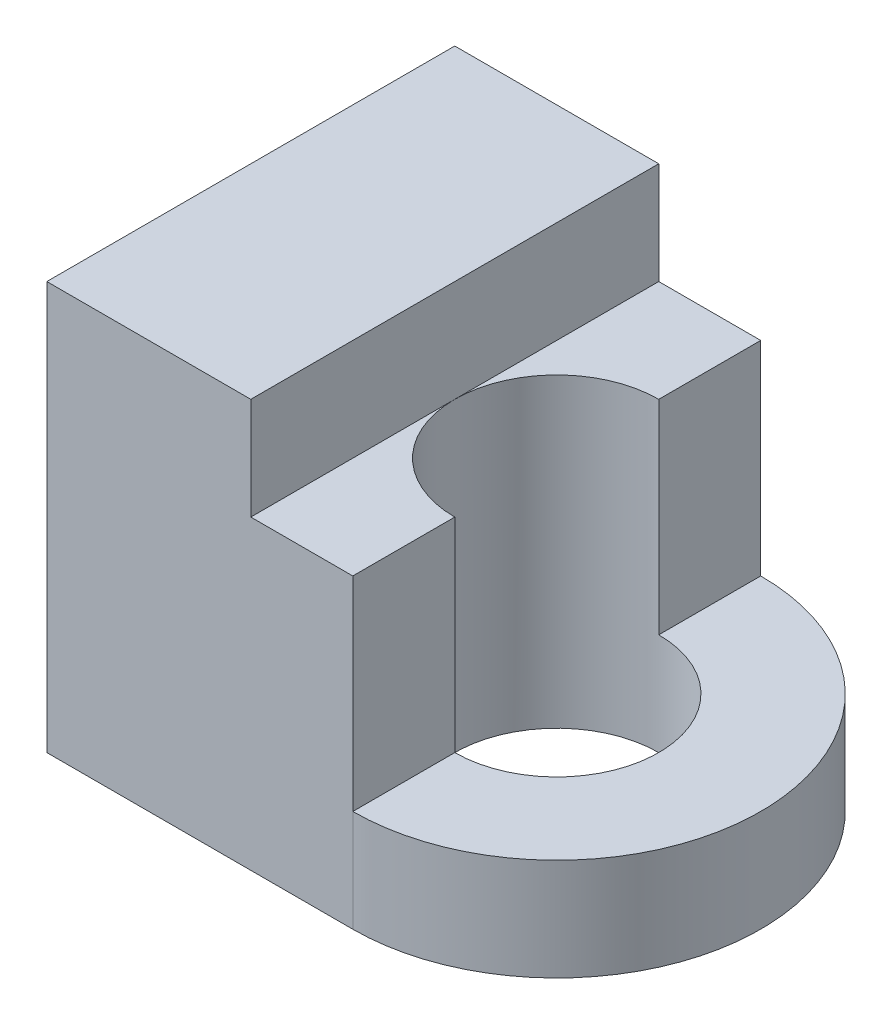
ISO-10303-21;
HEADER;
FILE_DESCRIPTION(('STEP AP214'),'2;1');
FILE_NAME('part.step','',(''),(''),'','','');
FILE_SCHEMA(('AUTOMOTIVE_DESIGN { 1 0 10303 214 1 1 1 1 }'));
ENDSEC;
DATA;
#1=APPLICATION_CONTEXT('core data for automotive mechanical design processes');
#2=APPLICATION_PROTOCOL_DEFINITION('international standard','automotive_design',2000,#1);
#3=PRODUCT_CONTEXT('',#1,'mechanical');
#4=PRODUCT('Part','Part','',(#3));
#5=PRODUCT_RELATED_PRODUCT_CATEGORY('part','',(#4));
#6=PRODUCT_DEFINITION_FORMATION('','',#4);
#7=PRODUCT_DEFINITION_CONTEXT('part definition',#1,'design');
#8=PRODUCT_DEFINITION('design','',#6,#7);
#9=PRODUCT_DEFINITION_SHAPE('','',#8);
#10=(LENGTH_UNIT() NAMED_UNIT(*) SI_UNIT(.MILLI.,.METRE.));
#11=(NAMED_UNIT(*) PLANE_ANGLE_UNIT() SI_UNIT($,.RADIAN.));
#12=(NAMED_UNIT(*) SI_UNIT($,.STERADIAN.) SOLID_ANGLE_UNIT());
#13=UNCERTAINTY_MEASURE_WITH_UNIT(LENGTH_MEASURE(1.E-05),#10,'distance_accuracy_value','');
#14=(GEOMETRIC_REPRESENTATION_CONTEXT(3) GLOBAL_UNCERTAINTY_ASSIGNED_CONTEXT((#13)) GLOBAL_UNIT_ASSIGNED_CONTEXT((#10,
#11,#12)) REPRESENTATION_CONTEXT('',''));
#15=CARTESIAN_POINT('',(0.,0.,0.));
#16=DIRECTION('',(0.,0.,1.));
#17=DIRECTION('',(1.,0.,0.));
#18=AXIS2_PLACEMENT_3D('',#15,#16,#17);
#19=CARTESIAN_POINT('',(0.,40.,0.));
#20=DIRECTION('',(0.,-1.,0.));
#21=DIRECTION('',(0.,0.,-1.));
#22=AXIS2_PLACEMENT_3D('',#19,#20,#21);
#23=CYLINDRICAL_SURFACE('',#22,10.);
#24=CARTESIAN_POINT('',(0.,0.,0.));
#25=DIRECTION('',(0.,1.,0.));
#26=DIRECTION('',(0.,0.,1.));
#27=AXIS2_PLACEMENT_3D('',#24,#25,#26);
#28=CIRCLE('',#27,10.);
#29=CARTESIAN_POINT('',(0.,0.,10.));
#30=VERTEX_POINT('',#29);
#31=EDGE_CURVE('E172',#30,#30,#28,.T.);
#32=ORIENTED_EDGE('',*,*,#31,.F.);
#33=EDGE_LOOP('',(#32));
#34=FACE_BOUND('',#33,.T.);
#35=CARTESIAN_POINT('',(0.,30.,0.));
#36=DIRECTION('',(0.,1.,0.));
#37=DIRECTION('',(0.,0.,1.));
#38=AXIS2_PLACEMENT_3D('',#35,#36,#37);
#39=CIRCLE('',#38,10.);
#40=CARTESIAN_POINT('',(-10.,30.,0.));
#41=VERTEX_POINT('',#40);
#42=CARTESIAN_POINT('',(1.57116660247941E-13,30.,10.));
#43=VERTEX_POINT('',#42);
#44=EDGE_CURVE('E147',#41,#43,#39,.T.);
#45=ORIENTED_EDGE('',*,*,#44,.T.);
#46=DIRECTION('',(0.,-1.,0.));
#47=VECTOR('',#46,1.);
#48=CARTESIAN_POINT('',(1.57116660247941E-13,40.,10.));
#49=LINE('',#48,#47);
#50=CARTESIAN_POINT('',(1.57116660247941E-13,10.,10.));
#51=VERTEX_POINT('',#50);
#52=EDGE_CURVE('E124',#43,#51,#49,.T.);
#53=ORIENTED_EDGE('',*,*,#52,.T.);
#54=CARTESIAN_POINT('',(0.,10.,0.));
#55=DIRECTION('',(0.,-1.,0.));
#56=DIRECTION('',(0.,0.,-1.));
#57=AXIS2_PLACEMENT_3D('',#54,#55,#56);
#58=CIRCLE('',#57,10.);
#59=CARTESIAN_POINT('',(0.,10.,-10.));
#60=VERTEX_POINT('',#59);
#61=EDGE_CURVE('E12',#60,#51,#58,.T.);
#62=ORIENTED_EDGE('',*,*,#61,.F.);
#63=DIRECTION('',(0.,-1.,0.));
#64=VECTOR('',#63,1.);
#65=CARTESIAN_POINT('',(0.,40.,-10.));
#66=LINE('',#65,#64);
#67=CARTESIAN_POINT('',(0.,30.,-10.));
#68=VERTEX_POINT('',#67);
#69=EDGE_CURVE('E131',#60,#68,#66,.F.);
#70=ORIENTED_EDGE('',*,*,#69,.T.);
#71=EDGE_CURVE('E60',#68,#41,#39,.T.);
#72=ORIENTED_EDGE('',*,*,#71,.T.);
#73=EDGE_LOOP('',(#45,#53,#62,#70,#72));
#74=FACE_BOUND('',#73,.T.);
#75=ADVANCED_FACE('F37',(#34,#74),#23,.F.);
#76=CARTESIAN_POINT('',(-5.,30.,0.));
#77=DIRECTION('',(0.,1.,0.));
#78=DIRECTION('',(0.,0.,1.));
#79=AXIS2_PLACEMENT_3D('',#76,#77,#78);
#80=PLANE('',#79);
#81=DIRECTION('',(1.,0.,0.));
#82=VECTOR('',#81,1.);
#83=CARTESIAN_POINT('',(-30.,30.,20.));
#84=LINE('',#83,#82);
#85=CARTESIAN_POINT('',(-10.,30.,20.));
#86=VERTEX_POINT('',#85);
#87=CARTESIAN_POINT('',(2.09488880330588E-13,30.,20.));
#88=VERTEX_POINT('',#87);
#89=EDGE_CURVE('E167',#86,#88,#84,.T.);
#90=ORIENTED_EDGE('',*,*,#89,.T.);
#91=DIRECTION('',(0.,0.,-1.));
#92=VECTOR('',#91,1.);
#93=CARTESIAN_POINT('',(2.09488880330588E-13,30.,20.));
#94=LINE('',#93,#92);
#95=EDGE_CURVE('E132',#88,#43,#94,.T.);
#96=ORIENTED_EDGE('',*,*,#95,.T.);
#97=ORIENTED_EDGE('',*,*,#44,.F.);
#98=DIRECTION('',(0.,0.,-1.));
#99=VECTOR('',#98,1.);
#100=CARTESIAN_POINT('',(-10.,30.,-20.));
#101=LINE('',#100,#99);
#102=EDGE_CURVE('E160',#86,#41,#101,.T.);
#103=ORIENTED_EDGE('',*,*,#102,.F.);
#104=EDGE_LOOP('',(#90,#96,#97,#103));
#105=FACE_BOUND('',#104,.T.);
#106=ADVANCED_FACE('F215',(#105),#80,.T.);
#107=ORIENTED_EDGE('',*,*,#71,.F.);
#108=DIRECTION('',(0.,0.,-1.));
#109=VECTOR('',#108,1.);
#110=CARTESIAN_POINT('',(1.04950770296597E-13,30.,0.));
#111=LINE('',#110,#109);
#112=CARTESIAN_POINT('',(0.,30.,-20.));
#113=VERTEX_POINT('',#112);
#114=EDGE_CURVE('E45',#68,#113,#111,.T.);
#115=ORIENTED_EDGE('',*,*,#114,.T.);
#116=DIRECTION('',(-1.,0.,0.));
#117=VECTOR('',#116,1.);
#118=CARTESIAN_POINT('',(0.,30.,-20.));
#119=LINE('',#118,#117);
#120=CARTESIAN_POINT('',(-10.,30.,-20.));
#121=VERTEX_POINT('',#120);
#122=EDGE_CURVE('E146',#113,#121,#119,.T.);
#123=ORIENTED_EDGE('',*,*,#122,.T.);
#124=EDGE_CURVE('E163',#41,#121,#101,.T.);
#125=ORIENTED_EDGE('',*,*,#124,.F.);
#126=EDGE_LOOP('',(#107,#115,#123,#125));
#127=FACE_BOUND('',#126,.T.);
#128=ADVANCED_FACE('F152',(#127),#80,.T.);
#129=CARTESIAN_POINT('',(0.,40.,0.));
#130=DIRECTION('',(0.,1.,0.));
#131=DIRECTION('',(0.,0.,1.));
#132=AXIS2_PLACEMENT_3D('',#129,#130,#131);
#133=PLANE('',#132);
#134=DIRECTION('',(1.,0.,0.));
#135=VECTOR('',#134,1.);
#136=CARTESIAN_POINT('',(-30.,40.,20.));
#137=LINE('',#136,#135);
#138=CARTESIAN_POINT('',(-30.,40.,20.));
#139=VERTEX_POINT('',#138);
#140=CARTESIAN_POINT('',(-10.,40.,20.));
#141=VERTEX_POINT('',#140);
#142=EDGE_CURVE('E180',#139,#141,#137,.T.);
#143=ORIENTED_EDGE('',*,*,#142,.T.);
#144=DIRECTION('',(0.,0.,-1.));
#145=VECTOR('',#144,1.);
#146=CARTESIAN_POINT('',(-10.,40.,-20.));
#147=LINE('',#146,#145);
#148=CARTESIAN_POINT('',(-10.,40.,-20.));
#149=VERTEX_POINT('',#148);
#150=EDGE_CURVE('E52',#141,#149,#147,.T.);
#151=ORIENTED_EDGE('',*,*,#150,.T.);
#152=DIRECTION('',(-1.,0.,0.));
#153=VECTOR('',#152,1.);
#154=CARTESIAN_POINT('',(0.,40.,-20.));
#155=LINE('',#154,#153);
#156=CARTESIAN_POINT('',(-30.,40.,-20.));
#157=VERTEX_POINT('',#156);
#158=EDGE_CURVE('E175',#149,#157,#155,.T.);
#159=ORIENTED_EDGE('',*,*,#158,.T.);
#160=DIRECTION('',(0.,0.,1.));
#161=VECTOR('',#160,1.);
#162=CARTESIAN_POINT('',(-30.,40.,-20.));
#163=LINE('',#162,#161);
#164=EDGE_CURVE('E177',#157,#139,#163,.T.);
#165=ORIENTED_EDGE('',*,*,#164,.T.);
#166=EDGE_LOOP('',(#143,#151,#159,#165));
#167=FACE_BOUND('',#166,.T.);
#168=ADVANCED_FACE('F218',(#167),#133,.T.);
#169=CARTESIAN_POINT('',(0.,40.,0.));
#170=DIRECTION('',(0.,-1.,0.));
#171=DIRECTION('',(0.,0.,-1.));
#172=AXIS2_PLACEMENT_3D('',#169,#170,#171);
#173=CYLINDRICAL_SURFACE('',#172,20.);
#174=DIRECTION('',(0.,-1.,0.));
#175=VECTOR('',#174,1.);
#176=CARTESIAN_POINT('',(0.,40.,-20.));
#177=LINE('',#176,#175);
#178=CARTESIAN_POINT('',(0.,10.,-20.));
#179=VERTEX_POINT('',#178);
#180=CARTESIAN_POINT('',(0.,0.,-20.));
#181=VERTEX_POINT('',#180);
#182=EDGE_CURVE('E135',#179,#181,#177,.T.);
#183=ORIENTED_EDGE('',*,*,#182,.F.);
#184=CARTESIAN_POINT('',(0.,10.,0.));
#185=DIRECTION('',(0.,-1.,0.));
#186=DIRECTION('',(0.,0.,-1.));
#187=AXIS2_PLACEMENT_3D('',#184,#185,#186);
#188=CIRCLE('',#187,20.);
#189=CARTESIAN_POINT('',(2.09488880330588E-13,10.,20.));
#190=VERTEX_POINT('',#189);
#191=EDGE_CURVE('E114',#179,#190,#188,.T.);
#192=ORIENTED_EDGE('',*,*,#191,.T.);
#193=DIRECTION('',(0.,-1.,0.));
#194=VECTOR('',#193,1.);
#195=CARTESIAN_POINT('',(0.,40.,20.));
#196=LINE('',#195,#194);
#197=CARTESIAN_POINT('',(0.,0.,20.));
#198=VERTEX_POINT('',#197);
#199=EDGE_CURVE('E183',#190,#198,#196,.T.);
#200=ORIENTED_EDGE('',*,*,#199,.T.);
#201=CARTESIAN_POINT('',(0.,0.,0.));
#202=DIRECTION('',(0.,1.,0.));
#203=DIRECTION('',(0.,0.,1.));
#204=AXIS2_PLACEMENT_3D('',#201,#202,#203);
#205=CIRCLE('',#204,20.);
#206=EDGE_CURVE('E137',#198,#181,#205,.T.);
#207=ORIENTED_EDGE('',*,*,#206,.T.);
#208=EDGE_LOOP('',(#183,#192,#200,#207));
#209=FACE_BOUND('',#208,.T.);
#210=ADVANCED_FACE('F39',(#209),#173,.T.);
#211=CARTESIAN_POINT('',(-30.,40.,20.));
#212=DIRECTION('',(0.,0.,-1.));
#213=DIRECTION('',(-1.,0.,0.));
#214=AXIS2_PLACEMENT_3D('',#211,#212,#213);
#215=PLANE('',#214);
#216=DIRECTION('',(0.,-1.,0.));
#217=VECTOR('',#216,1.);
#218=CARTESIAN_POINT('',(-30.,40.,20.));
#219=LINE('',#218,#217);
#220=CARTESIAN_POINT('',(-30.,0.,20.));
#221=VERTEX_POINT('',#220);
#222=EDGE_CURVE('E193',#139,#221,#219,.T.);
#223=ORIENTED_EDGE('',*,*,#222,.T.);
#224=DIRECTION('',(1.,0.,0.));
#225=VECTOR('',#224,1.);
#226=CARTESIAN_POINT('',(-30.,0.,20.));
#227=LINE('',#226,#225);
#228=EDGE_CURVE('E178',#221,#198,#227,.T.);
#229=ORIENTED_EDGE('',*,*,#228,.T.);
#230=ORIENTED_EDGE('',*,*,#199,.F.);
#231=EDGE_CURVE('E192',#88,#190,#196,.T.);
#232=ORIENTED_EDGE('',*,*,#231,.F.);
#233=ORIENTED_EDGE('',*,*,#89,.F.);
#234=DIRECTION('',(0.,1.,0.));
#235=VECTOR('',#234,1.);
#236=CARTESIAN_POINT('',(-10.,30.,20.));
#237=LINE('',#236,#235);
#238=EDGE_CURVE('E162',#86,#141,#237,.T.);
#239=ORIENTED_EDGE('',*,*,#238,.T.);
#240=ORIENTED_EDGE('',*,*,#142,.F.);
#241=EDGE_LOOP('',(#223,#229,#230,#232,#233,#239,#240));
#242=FACE_BOUND('',#241,.T.);
#243=ADVANCED_FACE('F207',(#242),#215,.F.);
#244=CARTESIAN_POINT('',(0.,0.,0.));
#245=DIRECTION('',(0.,1.,0.));
#246=DIRECTION('',(0.,0.,1.));
#247=AXIS2_PLACEMENT_3D('',#244,#245,#246);
#248=PLANE('',#247);
#249=ORIENTED_EDGE('',*,*,#206,.F.);
#250=ORIENTED_EDGE('',*,*,#228,.F.);
#251=DIRECTION('',(0.,0.,1.));
#252=VECTOR('',#251,1.);
#253=CARTESIAN_POINT('',(-30.,0.,-20.));
#254=LINE('',#253,#252);
#255=CARTESIAN_POINT('',(-30.,0.,-20.));
#256=VERTEX_POINT('',#255);
#257=EDGE_CURVE('E187',#256,#221,#254,.T.);
#258=ORIENTED_EDGE('',*,*,#257,.F.);
#259=DIRECTION('',(-1.,0.,0.));
#260=VECTOR('',#259,1.);
#261=CARTESIAN_POINT('',(0.,0.,-20.));
#262=LINE('',#261,#260);
#263=EDGE_CURVE('E185',#181,#256,#262,.T.);
#264=ORIENTED_EDGE('',*,*,#263,.F.);
#265=EDGE_LOOP('',(#249,#250,#258,#264));
#266=FACE_BOUND('',#265,.T.);
#267=ORIENTED_EDGE('',*,*,#31,.T.);
#268=EDGE_LOOP('',(#267));
#269=FACE_BOUND('',#268,.T.);
#270=ADVANCED_FACE('F205',(#266,#269),#248,.F.);
#271=CARTESIAN_POINT('',(0.,40.,-20.));
#272=DIRECTION('',(0.,0.,1.));
#273=DIRECTION('',(1.,0.,0.));
#274=AXIS2_PLACEMENT_3D('',#271,#272,#273);
#275=PLANE('',#274);
#276=DIRECTION('',(0.,1.,0.));
#277=VECTOR('',#276,1.);
#278=CARTESIAN_POINT('',(-10.,30.,-20.));
#279=LINE('',#278,#277);
#280=EDGE_CURVE('E165',#121,#149,#279,.T.);
#281=ORIENTED_EDGE('',*,*,#280,.F.);
#282=ORIENTED_EDGE('',*,*,#122,.F.);
#283=EDGE_CURVE('E129',#113,#179,#177,.T.);
#284=ORIENTED_EDGE('',*,*,#283,.T.);
#285=ORIENTED_EDGE('',*,*,#182,.T.);
#286=ORIENTED_EDGE('',*,*,#263,.T.);
#287=DIRECTION('',(0.,-1.,0.));
#288=VECTOR('',#287,1.);
#289=CARTESIAN_POINT('',(-30.,40.,-20.));
#290=LINE('',#289,#288);
#291=EDGE_CURVE('E141',#157,#256,#290,.T.);
#292=ORIENTED_EDGE('',*,*,#291,.F.);
#293=ORIENTED_EDGE('',*,*,#158,.F.);
#294=EDGE_LOOP('',(#281,#282,#284,#285,#286,#292,#293));
#295=FACE_BOUND('',#294,.T.);
#296=ADVANCED_FACE('F145',(#295),#275,.F.);
#297=CARTESIAN_POINT('',(-30.,40.,-20.));
#298=DIRECTION('',(1.,0.,0.));
#299=DIRECTION('',(0.,0.,-1.));
#300=AXIS2_PLACEMENT_3D('',#297,#298,#299);
#301=PLANE('',#300);
#302=ORIENTED_EDGE('',*,*,#291,.T.);
#303=ORIENTED_EDGE('',*,*,#257,.T.);
#304=ORIENTED_EDGE('',*,*,#222,.F.);
#305=ORIENTED_EDGE('',*,*,#164,.F.);
#306=EDGE_LOOP('',(#302,#303,#304,#305));
#307=FACE_BOUND('',#306,.T.);
#308=ADVANCED_FACE('F200',(#307),#301,.F.);
#309=CARTESIAN_POINT('',(-10.,30.,-20.));
#310=DIRECTION('',(1.,0.,0.));
#311=DIRECTION('',(0.,0.,-1.));
#312=AXIS2_PLACEMENT_3D('',#309,#310,#311);
#313=PLANE('',#312);
#314=ORIENTED_EDGE('',*,*,#150,.F.);
#315=ORIENTED_EDGE('',*,*,#238,.F.);
#316=ORIENTED_EDGE('',*,*,#102,.T.);
#317=ORIENTED_EDGE('',*,*,#124,.T.);
#318=ORIENTED_EDGE('',*,*,#280,.T.);
#319=EDGE_LOOP('',(#314,#315,#316,#317,#318));
#320=FACE_BOUND('',#319,.T.);
#321=ADVANCED_FACE('F216',(#320),#313,.T.);
#322=CARTESIAN_POINT('',(0.,10.,0.));
#323=DIRECTION('',(0.,-1.,0.));
#324=DIRECTION('',(0.,0.,-1.));
#325=AXIS2_PLACEMENT_3D('',#322,#323,#324);
#326=PLANE('',#325);
#327=DIRECTION('',(0.,0.,-1.));
#328=VECTOR('',#327,1.);
#329=CARTESIAN_POINT('',(2.09488880330588E-13,10.,20.));
#330=LINE('',#329,#328);
#331=EDGE_CURVE('E117',#60,#179,#330,.T.);
#332=ORIENTED_EDGE('',*,*,#331,.F.);
#333=ORIENTED_EDGE('',*,*,#61,.T.);
#334=EDGE_CURVE('E120',#190,#51,#330,.T.);
#335=ORIENTED_EDGE('',*,*,#334,.F.);
#336=ORIENTED_EDGE('',*,*,#191,.F.);
#337=EDGE_LOOP('',(#332,#333,#335,#336));
#338=FACE_BOUND('',#337,.T.);
#339=ADVANCED_FACE('F116',(#338),#326,.F.);
#340=CARTESIAN_POINT('',(2.09488880330588E-13,10.,20.));
#341=DIRECTION('',(1.,0.,0.));
#342=DIRECTION('',(0.,0.,-1.));
#343=AXIS2_PLACEMENT_3D('',#340,#341,#342);
#344=PLANE('',#343);
#345=ORIENTED_EDGE('',*,*,#95,.F.);
#346=ORIENTED_EDGE('',*,*,#231,.T.);
#347=ORIENTED_EDGE('',*,*,#334,.T.);
#348=ORIENTED_EDGE('',*,*,#52,.F.);
#349=EDGE_LOOP('',(#345,#346,#347,#348));
#350=FACE_BOUND('',#349,.T.);
#351=ADVANCED_FACE('F211',(#350),#344,.T.);
#352=ORIENTED_EDGE('',*,*,#331,.T.);
#353=ORIENTED_EDGE('',*,*,#283,.F.);
#354=ORIENTED_EDGE('',*,*,#114,.F.);
#355=ORIENTED_EDGE('',*,*,#69,.F.);
#356=EDGE_LOOP('',(#352,#353,#354,#355));
#357=FACE_BOUND('',#356,.T.);
#358=ADVANCED_FACE('F127',(#357),#344,.T.);
#359=CLOSED_SHELL('',(#75,#106,#128,#168,#210,#243,#270,#296,#308,#321,#339,#351,#358));
#360=MANIFOLD_SOLID_BREP('B2',#359);
#361=ADVANCED_BREP_SHAPE_REPRESENTATION('',(#18,#360),#14);
#362=SHAPE_DEFINITION_REPRESENTATION(#9,#361);
ENDSEC;
END-ISO-10303-21;
